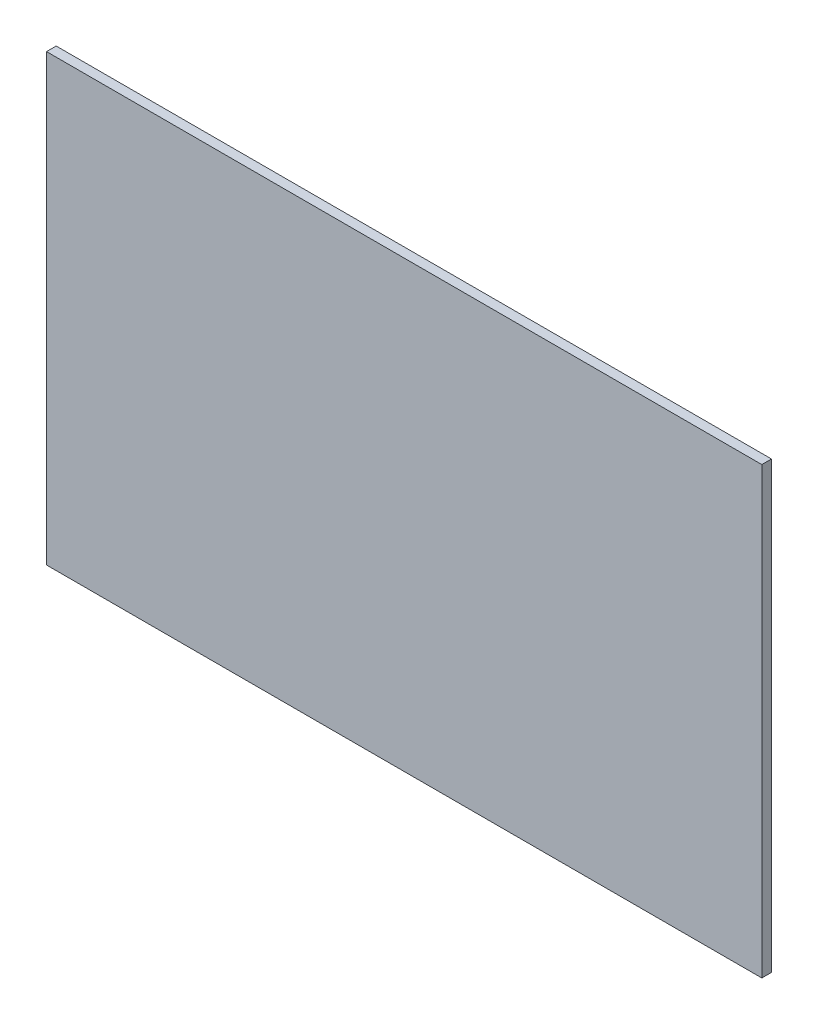
ISO-10303-21;
HEADER;
FILE_DESCRIPTION(('STEP AP214'),'2;1');
FILE_NAME('part.step','',(''),(''),'','','');
FILE_SCHEMA(('AUTOMOTIVE_DESIGN { 1 0 10303 214 1 1 1 1 }'));
ENDSEC;
DATA;
#1=APPLICATION_CONTEXT('core data for automotive mechanical design processes');
#2=APPLICATION_PROTOCOL_DEFINITION('international standard','automotive_design',2000,#1);
#3=PRODUCT_CONTEXT('',#1,'mechanical');
#4=PRODUCT('Part','Part','',(#3));
#5=PRODUCT_RELATED_PRODUCT_CATEGORY('part','',(#4));
#6=PRODUCT_DEFINITION_FORMATION('','',#4);
#7=PRODUCT_DEFINITION_CONTEXT('part definition',#1,'design');
#8=PRODUCT_DEFINITION('design','',#6,#7);
#9=PRODUCT_DEFINITION_SHAPE('','',#8);
#10=(LENGTH_UNIT() NAMED_UNIT(*) SI_UNIT(.MILLI.,.METRE.));
#11=(NAMED_UNIT(*) PLANE_ANGLE_UNIT() SI_UNIT($,.RADIAN.));
#12=(NAMED_UNIT(*) SI_UNIT($,.STERADIAN.) SOLID_ANGLE_UNIT());
#13=UNCERTAINTY_MEASURE_WITH_UNIT(LENGTH_MEASURE(1.E-05),#10,'distance_accuracy_value','');
#14=(GEOMETRIC_REPRESENTATION_CONTEXT(3) GLOBAL_UNCERTAINTY_ASSIGNED_CONTEXT((#13)) GLOBAL_UNIT_ASSIGNED_CONTEXT((#10,
#11,#12)) REPRESENTATION_CONTEXT('',''));
#15=CARTESIAN_POINT('',(0.,0.,0.));
#16=DIRECTION('',(0.,0.,1.));
#17=DIRECTION('',(1.,0.,0.));
#18=AXIS2_PLACEMENT_3D('',#15,#16,#17);
#19=CARTESIAN_POINT('',(0.,0.,6.35));
#20=DIRECTION('',(1.,0.,0.));
#21=DIRECTION('',(0.,0.,-1.));
#22=AXIS2_PLACEMENT_3D('',#19,#20,#21);
#23=PLANE('',#22);
#24=DIRECTION('',(0.,-1.,0.));
#25=VECTOR('',#24,1.);
#26=CARTESIAN_POINT('',(0.,0.,0.));
#27=LINE('',#26,#25);
#28=CARTESIAN_POINT('',(0.,292.1,0.));
#29=VERTEX_POINT('',#28);
#30=CARTESIAN_POINT('',(0.,0.,0.));
#31=VERTEX_POINT('',#30);
#32=EDGE_CURVE('E96',#29,#31,#27,.T.);
#33=ORIENTED_EDGE('',*,*,#32,.T.);
#34=DIRECTION('',(0.,0.,-1.));
#35=VECTOR('',#34,1.);
#36=CARTESIAN_POINT('',(0.,0.,6.35));
#37=LINE('',#36,#35);
#38=CARTESIAN_POINT('',(0.,0.,6.35));
#39=VERTEX_POINT('',#38);
#40=EDGE_CURVE('E11',#39,#31,#37,.T.);
#41=ORIENTED_EDGE('',*,*,#40,.F.);
#42=DIRECTION('',(0.,-1.,0.));
#43=VECTOR('',#42,1.);
#44=CARTESIAN_POINT('',(0.,0.,6.35));
#45=LINE('',#44,#43);
#46=CARTESIAN_POINT('',(0.,292.1,6.35));
#47=VERTEX_POINT('',#46);
#48=EDGE_CURVE('E84',#47,#39,#45,.T.);
#49=ORIENTED_EDGE('',*,*,#48,.F.);
#50=DIRECTION('',(0.,0.,-1.));
#51=VECTOR('',#50,1.);
#52=CARTESIAN_POINT('',(0.,292.1,6.35));
#53=LINE('',#52,#51);
#54=EDGE_CURVE('E92',#47,#29,#53,.T.);
#55=ORIENTED_EDGE('',*,*,#54,.T.);
#56=EDGE_LOOP('',(#33,#41,#49,#55));
#57=FACE_BOUND('',#56,.T.);
#58=ADVANCED_FACE('F33',(#57),#23,.F.);
#59=CARTESIAN_POINT('',(0.,0.,6.35));
#60=DIRECTION('',(0.,1.,0.));
#61=DIRECTION('',(0.,0.,1.));
#62=AXIS2_PLACEMENT_3D('',#59,#60,#61);
#63=PLANE('',#62);
#64=DIRECTION('',(1.,0.,0.));
#65=VECTOR('',#64,1.);
#66=CARTESIAN_POINT('',(0.,0.,0.));
#67=LINE('',#66,#65);
#68=CARTESIAN_POINT('',(469.9,0.,0.));
#69=VERTEX_POINT('',#68);
#70=EDGE_CURVE('E88',#31,#69,#67,.T.);
#71=ORIENTED_EDGE('',*,*,#70,.T.);
#72=DIRECTION('',(0.,0.,-1.));
#73=VECTOR('',#72,1.);
#74=CARTESIAN_POINT('',(469.9,0.,6.35));
#75=LINE('',#74,#73);
#76=CARTESIAN_POINT('',(469.9,0.,6.35));
#77=VERTEX_POINT('',#76);
#78=EDGE_CURVE('E41',#77,#69,#75,.T.);
#79=ORIENTED_EDGE('',*,*,#78,.F.);
#80=DIRECTION('',(1.,0.,0.));
#81=VECTOR('',#80,1.);
#82=CARTESIAN_POINT('',(0.,0.,6.35));
#83=LINE('',#82,#81);
#84=EDGE_CURVE('E79',#39,#77,#83,.T.);
#85=ORIENTED_EDGE('',*,*,#84,.F.);
#86=ORIENTED_EDGE('',*,*,#40,.T.);
#87=EDGE_LOOP('',(#71,#79,#85,#86));
#88=FACE_BOUND('',#87,.T.);
#89=ADVANCED_FACE('F87',(#88),#63,.F.);
#90=CARTESIAN_POINT('',(469.9,0.,6.35));
#91=DIRECTION('',(-1.,0.,0.));
#92=DIRECTION('',(0.,0.,1.));
#93=AXIS2_PLACEMENT_3D('',#90,#91,#92);
#94=PLANE('',#93);
#95=DIRECTION('',(0.,1.,0.));
#96=VECTOR('',#95,1.);
#97=CARTESIAN_POINT('',(469.9,0.,0.));
#98=LINE('',#97,#96);
#99=CARTESIAN_POINT('',(469.9,292.1,0.));
#100=VERTEX_POINT('',#99);
#101=EDGE_CURVE('E66',#69,#100,#98,.T.);
#102=ORIENTED_EDGE('',*,*,#101,.T.);
#103=DIRECTION('',(0.,0.,-1.));
#104=VECTOR('',#103,1.);
#105=CARTESIAN_POINT('',(469.9,292.1,6.35));
#106=LINE('',#105,#104);
#107=CARTESIAN_POINT('',(469.9,292.1,6.35));
#108=VERTEX_POINT('',#107);
#109=EDGE_CURVE('E89',#108,#100,#106,.T.);
#110=ORIENTED_EDGE('',*,*,#109,.F.);
#111=DIRECTION('',(0.,1.,0.));
#112=VECTOR('',#111,1.);
#113=CARTESIAN_POINT('',(469.9,0.,6.35));
#114=LINE('',#113,#112);
#115=EDGE_CURVE('E82',#77,#108,#114,.T.);
#116=ORIENTED_EDGE('',*,*,#115,.F.);
#117=ORIENTED_EDGE('',*,*,#78,.T.);
#118=EDGE_LOOP('',(#102,#110,#116,#117));
#119=FACE_BOUND('',#118,.T.);
#120=ADVANCED_FACE('F90',(#119),#94,.F.);
#121=CARTESIAN_POINT('',(0.,292.1,6.35));
#122=DIRECTION('',(0.,-1.,0.));
#123=DIRECTION('',(0.,0.,-1.));
#124=AXIS2_PLACEMENT_3D('',#121,#122,#123);
#125=PLANE('',#124);
#126=DIRECTION('',(-1.,0.,0.));
#127=VECTOR('',#126,1.);
#128=CARTESIAN_POINT('',(0.,292.1,0.));
#129=LINE('',#128,#127);
#130=EDGE_CURVE('E72',#100,#29,#129,.T.);
#131=ORIENTED_EDGE('',*,*,#130,.T.);
#132=ORIENTED_EDGE('',*,*,#54,.F.);
#133=DIRECTION('',(-1.,0.,0.));
#134=VECTOR('',#133,1.);
#135=CARTESIAN_POINT('',(0.,292.1,6.35));
#136=LINE('',#135,#134);
#137=EDGE_CURVE('E49',#108,#47,#136,.T.);
#138=ORIENTED_EDGE('',*,*,#137,.F.);
#139=ORIENTED_EDGE('',*,*,#109,.T.);
#140=EDGE_LOOP('',(#131,#132,#138,#139));
#141=FACE_BOUND('',#140,.T.);
#142=ADVANCED_FACE('F103',(#141),#125,.F.);
#143=CARTESIAN_POINT('',(0.,0.,6.35));
#144=DIRECTION('',(0.,0.,-1.));
#145=DIRECTION('',(-1.,0.,0.));
#146=AXIS2_PLACEMENT_3D('',#143,#144,#145);
#147=PLANE('',#146);
#148=ORIENTED_EDGE('',*,*,#48,.T.);
#149=ORIENTED_EDGE('',*,*,#84,.T.);
#150=ORIENTED_EDGE('',*,*,#115,.T.);
#151=ORIENTED_EDGE('',*,*,#137,.T.);
#152=EDGE_LOOP('',(#148,#149,#150,#151));
#153=FACE_BOUND('',#152,.T.);
#154=ADVANCED_FACE('F80',(#153),#147,.F.);
#155=CARTESIAN_POINT('',(0.,0.,0.));
#156=DIRECTION('',(0.,0.,-1.));
#157=DIRECTION('',(-1.,0.,0.));
#158=AXIS2_PLACEMENT_3D('',#155,#156,#157);
#159=PLANE('',#158);
#160=ORIENTED_EDGE('',*,*,#32,.F.);
#161=ORIENTED_EDGE('',*,*,#130,.F.);
#162=ORIENTED_EDGE('',*,*,#101,.F.);
#163=ORIENTED_EDGE('',*,*,#70,.F.);
#164=EDGE_LOOP('',(#160,#161,#162,#163));
#165=FACE_BOUND('',#164,.T.);
#166=ADVANCED_FACE('F106',(#165),#159,.T.);
#167=CLOSED_SHELL('',(#58,#89,#120,#142,#154,#166));
#168=MANIFOLD_SOLID_BREP('B2',#167);
#169=ADVANCED_BREP_SHAPE_REPRESENTATION('',(#18,#168),#14);
#170=SHAPE_DEFINITION_REPRESENTATION(#9,#169);
ENDSEC;
END-ISO-10303-21;
